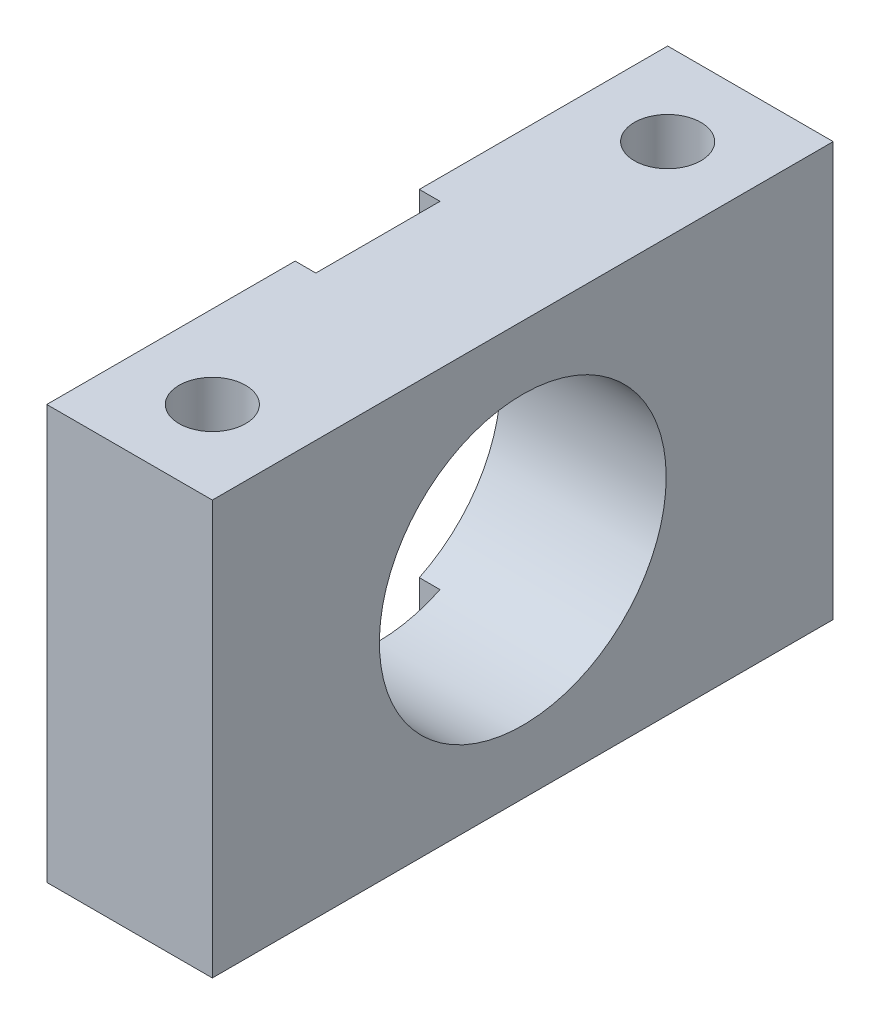
ISO-10303-21;
HEADER;
FILE_DESCRIPTION(('STEP AP214'),'2;1');
FILE_NAME('part.step','',(''),(''),'','','');
FILE_SCHEMA(('AUTOMOTIVE_DESIGN { 1 0 10303 214 1 1 1 1 }'));
ENDSEC;
DATA;
#1=APPLICATION_CONTEXT('core data for automotive mechanical design processes');
#2=APPLICATION_PROTOCOL_DEFINITION('international standard','automotive_design',2000,#1);
#3=PRODUCT_CONTEXT('',#1,'mechanical');
#4=PRODUCT('Part','Part','',(#3));
#5=PRODUCT_RELATED_PRODUCT_CATEGORY('part','',(#4));
#6=PRODUCT_DEFINITION_FORMATION('','',#4);
#7=PRODUCT_DEFINITION_CONTEXT('part definition',#1,'design');
#8=PRODUCT_DEFINITION('design','',#6,#7);
#9=PRODUCT_DEFINITION_SHAPE('','',#8);
#10=(LENGTH_UNIT() NAMED_UNIT(*) SI_UNIT(.MILLI.,.METRE.));
#11=(NAMED_UNIT(*) PLANE_ANGLE_UNIT() SI_UNIT($,.RADIAN.));
#12=(NAMED_UNIT(*) SI_UNIT($,.STERADIAN.) SOLID_ANGLE_UNIT());
#13=UNCERTAINTY_MEASURE_WITH_UNIT(LENGTH_MEASURE(1.E-05),#10,'distance_accuracy_value','');
#14=(GEOMETRIC_REPRESENTATION_CONTEXT(3) GLOBAL_UNCERTAINTY_ASSIGNED_CONTEXT((#13)) GLOBAL_UNIT_ASSIGNED_CONTEXT((#10,
#11,#12)) REPRESENTATION_CONTEXT('',''));
#15=CARTESIAN_POINT('',(0.,0.,0.));
#16=DIRECTION('',(0.,0.,1.));
#17=DIRECTION('',(1.,0.,0.));
#18=AXIS2_PLACEMENT_3D('',#15,#16,#17);
#19=CARTESIAN_POINT('',(-6.35,0.,0.));
#20=DIRECTION('',(1.,0.,0.));
#21=DIRECTION('',(0.,0.,-1.));
#22=AXIS2_PLACEMENT_3D('',#19,#20,#21);
#23=PLANE('',#22);
#24=DIRECTION('',(0.,0.,-1.));
#25=VECTOR('',#24,1.);
#26=CARTESIAN_POINT('',(-6.35,-15.875,-23.8125));
#27=LINE('',#26,#25);
#28=CARTESIAN_POINT('',(-6.35,-15.875,-4.7625));
#29=VERTEX_POINT('',#28);
#30=CARTESIAN_POINT('',(-6.35,-15.875,-23.8125));
#31=VERTEX_POINT('',#30);
#32=EDGE_CURVE('E230',#29,#31,#27,.T.);
#33=ORIENTED_EDGE('',*,*,#32,.F.);
#34=DIRECTION('',(0.,-1.,0.));
#35=VECTOR('',#34,1.);
#36=CARTESIAN_POINT('',(-6.35,-17.8246376290881,-4.7625));
#37=LINE('',#36,#35);
#38=CARTESIAN_POINT('',(-6.35,-9.91557329406626,-4.7625));
#39=VERTEX_POINT('',#38);
#40=EDGE_CURVE('E141',#39,#29,#37,.T.);
#41=ORIENTED_EDGE('',*,*,#40,.F.);
#42=CARTESIAN_POINT('',(-6.35,0.,0.));
#43=DIRECTION('',(1.,0.,0.));
#44=DIRECTION('',(0.,0.,-1.));
#45=AXIS2_PLACEMENT_3D('',#42,#43,#44);
#46=CIRCLE('',#45,11.);
#47=CARTESIAN_POINT('',(-6.35,9.91557329406626,-4.7625));
#48=VERTEX_POINT('',#47);
#49=EDGE_CURVE('E139',#39,#48,#46,.T.);
#50=ORIENTED_EDGE('',*,*,#49,.T.);
#51=CARTESIAN_POINT('',(-6.35,15.875,-4.7625));
#52=VERTEX_POINT('',#51);
#53=EDGE_CURVE('E123',#52,#48,#37,.T.);
#54=ORIENTED_EDGE('',*,*,#53,.F.);
#55=DIRECTION('',(0.,0.,1.));
#56=VECTOR('',#55,1.);
#57=CARTESIAN_POINT('',(-6.35,15.875,-23.8125));
#58=LINE('',#57,#56);
#59=CARTESIAN_POINT('',(-6.35,15.875,-23.8125));
#60=VERTEX_POINT('',#59);
#61=EDGE_CURVE('E136',#60,#52,#58,.T.);
#62=ORIENTED_EDGE('',*,*,#61,.F.);
#63=DIRECTION('',(0.,1.,0.));
#64=VECTOR('',#63,1.);
#65=CARTESIAN_POINT('',(-6.35,-15.875,-23.8125));
#66=LINE('',#65,#64);
#67=EDGE_CURVE('E155',#31,#60,#66,.T.);
#68=ORIENTED_EDGE('',*,*,#67,.F.);
#69=EDGE_LOOP('',(#33,#41,#50,#54,#62,#68));
#70=FACE_BOUND('',#69,.T.);
#71=ADVANCED_FACE('F33',(#70),#23,.F.);
#72=CARTESIAN_POINT('',(6.35,0.,0.));
#73=DIRECTION('',(1.,0.,0.));
#74=DIRECTION('',(0.,0.,-1.));
#75=AXIS2_PLACEMENT_3D('',#72,#73,#74);
#76=PLANE('',#75);
#77=DIRECTION('',(0.,-1.,0.));
#78=VECTOR('',#77,1.);
#79=CARTESIAN_POINT('',(6.35,-15.875,23.8125));
#80=LINE('',#79,#78);
#81=CARTESIAN_POINT('',(6.35,15.875,23.8125));
#82=VERTEX_POINT('',#81);
#83=CARTESIAN_POINT('',(6.35,-15.875,23.8125));
#84=VERTEX_POINT('',#83);
#85=EDGE_CURVE('E149',#82,#84,#80,.T.);
#86=ORIENTED_EDGE('',*,*,#85,.T.);
#87=DIRECTION('',(0.,0.,-1.));
#88=VECTOR('',#87,1.);
#89=CARTESIAN_POINT('',(6.35,-15.875,-23.8125));
#90=LINE('',#89,#88);
#91=CARTESIAN_POINT('',(6.35,-15.875,-23.8125));
#92=VERTEX_POINT('',#91);
#93=EDGE_CURVE('E153',#84,#92,#90,.T.);
#94=ORIENTED_EDGE('',*,*,#93,.T.);
#95=DIRECTION('',(0.,1.,0.));
#96=VECTOR('',#95,1.);
#97=CARTESIAN_POINT('',(6.35,-15.875,-23.8125));
#98=LINE('',#97,#96);
#99=CARTESIAN_POINT('',(6.35,15.875,-23.8125));
#100=VERTEX_POINT('',#99);
#101=EDGE_CURVE('E226',#92,#100,#98,.T.);
#102=ORIENTED_EDGE('',*,*,#101,.T.);
#103=DIRECTION('',(0.,0.,1.));
#104=VECTOR('',#103,1.);
#105=CARTESIAN_POINT('',(6.35,15.875,-23.8125));
#106=LINE('',#105,#104);
#107=EDGE_CURVE('E162',#100,#82,#106,.T.);
#108=ORIENTED_EDGE('',*,*,#107,.T.);
#109=EDGE_LOOP('',(#86,#94,#102,#108));
#110=FACE_BOUND('',#109,.T.);
#111=CARTESIAN_POINT('',(6.35,0.,0.));
#112=DIRECTION('',(1.,0.,0.));
#113=DIRECTION('',(0.,0.,-1.));
#114=AXIS2_PLACEMENT_3D('',#111,#112,#113);
#115=CIRCLE('',#114,11.);
#116=CARTESIAN_POINT('',(6.35,0.,-11.));
#117=VERTEX_POINT('',#116);
#118=EDGE_CURVE('E219',#117,#117,#115,.T.);
#119=ORIENTED_EDGE('',*,*,#118,.F.);
#120=EDGE_LOOP('',(#119));
#121=FACE_BOUND('',#120,.T.);
#122=ADVANCED_FACE('F241',(#110,#121),#76,.T.);
#123=CARTESIAN_POINT('',(-6.35,15.875,4.7625));
#124=VERTEX_POINT('',#123);
#125=CARTESIAN_POINT('',(-6.35,15.875,23.8125));
#126=VERTEX_POINT('',#125);
#127=EDGE_CURVE('E150',#124,#126,#58,.T.);
#128=ORIENTED_EDGE('',*,*,#127,.F.);
#129=DIRECTION('',(0.,1.,0.));
#130=VECTOR('',#129,1.);
#131=CARTESIAN_POINT('',(-6.35,-17.8246376290881,4.7625));
#132=LINE('',#131,#130);
#133=CARTESIAN_POINT('',(-6.35,9.91557329406626,4.7625));
#134=VERTEX_POINT('',#133);
#135=EDGE_CURVE('E140',#134,#124,#132,.T.);
#136=ORIENTED_EDGE('',*,*,#135,.F.);
#137=CARTESIAN_POINT('',(-6.35,-9.91557329406626,4.7625));
#138=VERTEX_POINT('',#137);
#139=EDGE_CURVE('E223',#134,#138,#46,.T.);
#140=ORIENTED_EDGE('',*,*,#139,.T.);
#141=CARTESIAN_POINT('',(-6.35,-15.875,4.7625));
#142=VERTEX_POINT('',#141);
#143=EDGE_CURVE('E198',#142,#138,#132,.T.);
#144=ORIENTED_EDGE('',*,*,#143,.F.);
#145=CARTESIAN_POINT('',(-6.35,-15.875,23.8125));
#146=VERTEX_POINT('',#145);
#147=EDGE_CURVE('E231',#146,#142,#27,.T.);
#148=ORIENTED_EDGE('',*,*,#147,.F.);
#149=DIRECTION('',(0.,-1.,0.));
#150=VECTOR('',#149,1.);
#151=CARTESIAN_POINT('',(-6.35,-15.875,23.8125));
#152=LINE('',#151,#150);
#153=EDGE_CURVE('E222',#126,#146,#152,.T.);
#154=ORIENTED_EDGE('',*,*,#153,.F.);
#155=EDGE_LOOP('',(#128,#136,#140,#144,#148,#154));
#156=FACE_BOUND('',#155,.T.);
#157=ADVANCED_FACE('F250',(#156),#23,.F.);
#158=CARTESIAN_POINT('',(6.35,-15.875,23.8125));
#159=DIRECTION('',(0.,0.,-1.));
#160=DIRECTION('',(-1.,0.,0.));
#161=AXIS2_PLACEMENT_3D('',#158,#159,#160);
#162=PLANE('',#161);
#163=ORIENTED_EDGE('',*,*,#153,.T.);
#164=DIRECTION('',(-1.,0.,0.));
#165=VECTOR('',#164,1.);
#166=CARTESIAN_POINT('',(6.35,-15.875,23.8125));
#167=LINE('',#166,#165);
#168=EDGE_CURVE('E167',#84,#146,#167,.T.);
#169=ORIENTED_EDGE('',*,*,#168,.F.);
#170=ORIENTED_EDGE('',*,*,#85,.F.);
#171=DIRECTION('',(-1.,0.,0.));
#172=VECTOR('',#171,1.);
#173=CARTESIAN_POINT('',(6.35,15.875,23.8125));
#174=LINE('',#173,#172);
#175=EDGE_CURVE('E159',#82,#126,#174,.T.);
#176=ORIENTED_EDGE('',*,*,#175,.T.);
#177=EDGE_LOOP('',(#163,#169,#170,#176));
#178=FACE_BOUND('',#177,.T.);
#179=ADVANCED_FACE('F35',(#178),#162,.F.);
#180=CARTESIAN_POINT('',(6.35,-15.875,-23.8125));
#181=DIRECTION('',(0.,1.,0.));
#182=DIRECTION('',(0.,0.,1.));
#183=AXIS2_PLACEMENT_3D('',#180,#181,#182);
#184=PLANE('',#183);
#185=CARTESIAN_POINT('',(0.,-15.875,-17.4625));
#186=DIRECTION('',(0.,1.,0.));
#187=DIRECTION('',(0.,0.,1.));
#188=AXIS2_PLACEMENT_3D('',#185,#186,#187);
#189=CIRCLE('',#188,2.5527);
#190=CARTESIAN_POINT('',(0.,-15.875,-14.9098));
#191=VERTEX_POINT('',#190);
#192=EDGE_CURVE('E207',#191,#191,#189,.T.);
#193=ORIENTED_EDGE('',*,*,#192,.T.);
#194=EDGE_LOOP('',(#193));
#195=FACE_BOUND('',#194,.T.);
#196=CARTESIAN_POINT('',(0.,-15.875,17.4625));
#197=DIRECTION('',(0.,-1.,0.));
#198=DIRECTION('',(0.,0.,-1.));
#199=AXIS2_PLACEMENT_3D('',#196,#197,#198);
#200=CIRCLE('',#199,2.5527);
#201=CARTESIAN_POINT('',(0.,-15.875,14.9098));
#202=VERTEX_POINT('',#201);
#203=EDGE_CURVE('E211',#202,#202,#200,.T.);
#204=ORIENTED_EDGE('',*,*,#203,.F.);
#205=EDGE_LOOP('',(#204));
#206=FACE_BOUND('',#205,.T.);
#207=DIRECTION('',(0.,0.,1.));
#208=VECTOR('',#207,1.);
#209=CARTESIAN_POINT('',(-4.7625,-15.875,-23.8125));
#210=LINE('',#209,#208);
#211=CARTESIAN_POINT('',(-4.7625,-15.875,-4.7625));
#212=VERTEX_POINT('',#211);
#213=CARTESIAN_POINT('',(-4.7625,-15.875,4.7625));
#214=VERTEX_POINT('',#213);
#215=EDGE_CURVE('E200',#212,#214,#210,.T.);
#216=ORIENTED_EDGE('',*,*,#215,.F.);
#217=DIRECTION('',(-1.,0.,0.));
#218=VECTOR('',#217,1.);
#219=CARTESIAN_POINT('',(6.35,-15.875,-4.7625));
#220=LINE('',#219,#218);
#221=EDGE_CURVE('E128',#212,#29,#220,.T.);
#222=ORIENTED_EDGE('',*,*,#221,.T.);
#223=ORIENTED_EDGE('',*,*,#32,.T.);
#224=DIRECTION('',(-1.,0.,0.));
#225=VECTOR('',#224,1.);
#226=CARTESIAN_POINT('',(6.35,-15.875,-23.8125));
#227=LINE('',#226,#225);
#228=EDGE_CURVE('E164',#92,#31,#227,.T.);
#229=ORIENTED_EDGE('',*,*,#228,.F.);
#230=ORIENTED_EDGE('',*,*,#93,.F.);
#231=ORIENTED_EDGE('',*,*,#168,.T.);
#232=ORIENTED_EDGE('',*,*,#147,.T.);
#233=DIRECTION('',(1.,0.,0.));
#234=VECTOR('',#233,1.);
#235=CARTESIAN_POINT('',(6.35,-15.875,4.7625));
#236=LINE('',#235,#234);
#237=EDGE_CURVE('E129',#142,#214,#236,.T.);
#238=ORIENTED_EDGE('',*,*,#237,.T.);
#239=EDGE_LOOP('',(#216,#222,#223,#229,#230,#231,#232,#238));
#240=FACE_BOUND('',#239,.T.);
#241=ADVANCED_FACE('F236',(#195,#206,#240),#184,.F.);
#242=CARTESIAN_POINT('',(6.35,-15.875,-23.8125));
#243=DIRECTION('',(0.,0.,1.));
#244=DIRECTION('',(0.,-1.,0.));
#245=AXIS2_PLACEMENT_3D('',#242,#243,#244);
#246=PLANE('',#245);
#247=ORIENTED_EDGE('',*,*,#67,.T.);
#248=DIRECTION('',(-1.,0.,0.));
#249=VECTOR('',#248,1.);
#250=CARTESIAN_POINT('',(6.35,15.875,-23.8125));
#251=LINE('',#250,#249);
#252=EDGE_CURVE('E148',#100,#60,#251,.T.);
#253=ORIENTED_EDGE('',*,*,#252,.F.);
#254=ORIENTED_EDGE('',*,*,#101,.F.);
#255=ORIENTED_EDGE('',*,*,#228,.T.);
#256=EDGE_LOOP('',(#247,#253,#254,#255));
#257=FACE_BOUND('',#256,.T.);
#258=ADVANCED_FACE('F239',(#257),#246,.F.);
#259=CARTESIAN_POINT('',(6.35,15.875,-23.8125));
#260=DIRECTION('',(0.,-1.,0.));
#261=DIRECTION('',(0.,0.,-1.));
#262=AXIS2_PLACEMENT_3D('',#259,#260,#261);
#263=PLANE('',#262);
#264=ORIENTED_EDGE('',*,*,#61,.T.);
#265=DIRECTION('',(1.,0.,0.));
#266=VECTOR('',#265,1.);
#267=CARTESIAN_POINT('',(6.35,15.875,-4.7625));
#268=LINE('',#267,#266);
#269=CARTESIAN_POINT('',(-4.7625,15.875,-4.7625));
#270=VERTEX_POINT('',#269);
#271=EDGE_CURVE('E120',#52,#270,#268,.T.);
#272=ORIENTED_EDGE('',*,*,#271,.T.);
#273=DIRECTION('',(0.,0.,-1.));
#274=VECTOR('',#273,1.);
#275=CARTESIAN_POINT('',(-4.7625,15.875,-23.8125));
#276=LINE('',#275,#274);
#277=CARTESIAN_POINT('',(-4.7625,15.875,4.7625));
#278=VERTEX_POINT('',#277);
#279=EDGE_CURVE('E193',#278,#270,#276,.T.);
#280=ORIENTED_EDGE('',*,*,#279,.F.);
#281=DIRECTION('',(-1.,0.,0.));
#282=VECTOR('',#281,1.);
#283=CARTESIAN_POINT('',(6.35,15.875,4.7625));
#284=LINE('',#283,#282);
#285=EDGE_CURVE('E191',#278,#124,#284,.T.);
#286=ORIENTED_EDGE('',*,*,#285,.T.);
#287=ORIENTED_EDGE('',*,*,#127,.T.);
#288=ORIENTED_EDGE('',*,*,#175,.F.);
#289=ORIENTED_EDGE('',*,*,#107,.F.);
#290=ORIENTED_EDGE('',*,*,#252,.T.);
#291=EDGE_LOOP('',(#264,#272,#280,#286,#287,#288,#289,#290));
#292=FACE_BOUND('',#291,.T.);
#293=CARTESIAN_POINT('',(0.,15.875,-17.4625));
#294=DIRECTION('',(0.,1.,0.));
#295=DIRECTION('',(0.,0.,1.));
#296=AXIS2_PLACEMENT_3D('',#293,#294,#295);
#297=CIRCLE('',#296,2.5527);
#298=CARTESIAN_POINT('',(0.,15.875,-14.9098));
#299=VERTEX_POINT('',#298);
#300=EDGE_CURVE('E208',#299,#299,#297,.T.);
#301=ORIENTED_EDGE('',*,*,#300,.F.);
#302=EDGE_LOOP('',(#301));
#303=FACE_BOUND('',#302,.T.);
#304=CARTESIAN_POINT('',(0.,15.875,17.4625));
#305=DIRECTION('',(0.,-1.,0.));
#306=DIRECTION('',(0.,0.,-1.));
#307=AXIS2_PLACEMENT_3D('',#304,#305,#306);
#308=CIRCLE('',#307,2.5527);
#309=CARTESIAN_POINT('',(0.,15.875,14.9098));
#310=VERTEX_POINT('',#309);
#311=EDGE_CURVE('E214',#310,#310,#308,.T.);
#312=ORIENTED_EDGE('',*,*,#311,.T.);
#313=EDGE_LOOP('',(#312));
#314=FACE_BOUND('',#313,.T.);
#315=ADVANCED_FACE('F144',(#292,#303,#314),#263,.F.);
#316=CARTESIAN_POINT('',(6.35,0.,0.));
#317=DIRECTION('',(-1.,0.,0.));
#318=DIRECTION('',(0.,0.,1.));
#319=AXIS2_PLACEMENT_3D('',#316,#317,#318);
#320=CYLINDRICAL_SURFACE('',#319,11.);
#321=DIRECTION('',(-1.,0.,0.));
#322=VECTOR('',#321,1.);
#323=CARTESIAN_POINT('',(6.35,9.91557329406626,-4.7625));
#324=LINE('',#323,#322);
#325=CARTESIAN_POINT('',(-4.7625,9.91557329406626,-4.7625));
#326=VERTEX_POINT('',#325);
#327=EDGE_CURVE('E11',#48,#326,#324,.F.);
#328=ORIENTED_EDGE('',*,*,#327,.F.);
#329=ORIENTED_EDGE('',*,*,#49,.F.);
#330=DIRECTION('',(-1.,0.,0.));
#331=VECTOR('',#330,1.);
#332=CARTESIAN_POINT('',(6.35,-9.91557329406626,-4.7625));
#333=LINE('',#332,#331);
#334=CARTESIAN_POINT('',(-4.7625,-9.91557329406626,-4.7625));
#335=VERTEX_POINT('',#334);
#336=EDGE_CURVE('E176',#335,#39,#333,.T.);
#337=ORIENTED_EDGE('',*,*,#336,.F.);
#338=CARTESIAN_POINT('',(-4.7625,0.,0.));
#339=DIRECTION('',(-1.,0.,0.));
#340=DIRECTION('',(0.,0.,1.));
#341=AXIS2_PLACEMENT_3D('',#338,#339,#340);
#342=CIRCLE('',#341,11.);
#343=CARTESIAN_POINT('',(-4.7625,-9.91557329406626,4.7625));
#344=VERTEX_POINT('',#343);
#345=EDGE_CURVE('E170',#335,#344,#342,.T.);
#346=ORIENTED_EDGE('',*,*,#345,.T.);
#347=DIRECTION('',(-1.,0.,0.));
#348=VECTOR('',#347,1.);
#349=CARTESIAN_POINT('',(6.35,-9.91557329406626,4.7625));
#350=LINE('',#349,#348);
#351=EDGE_CURVE('E173',#138,#344,#350,.F.);
#352=ORIENTED_EDGE('',*,*,#351,.F.);
#353=ORIENTED_EDGE('',*,*,#139,.F.);
#354=DIRECTION('',(-1.,0.,0.));
#355=VECTOR('',#354,1.);
#356=CARTESIAN_POINT('',(6.35,9.91557329406626,4.7625));
#357=LINE('',#356,#355);
#358=CARTESIAN_POINT('',(-4.7625,9.91557329406626,4.7625));
#359=VERTEX_POINT('',#358);
#360=EDGE_CURVE('E41',#359,#134,#357,.T.);
#361=ORIENTED_EDGE('',*,*,#360,.F.);
#362=EDGE_CURVE('E174',#359,#326,#342,.T.);
#363=ORIENTED_EDGE('',*,*,#362,.T.);
#364=EDGE_LOOP('',(#328,#329,#337,#346,#352,#353,#361,#363));
#365=FACE_BOUND('',#364,.T.);
#366=ORIENTED_EDGE('',*,*,#118,.T.);
#367=EDGE_LOOP('',(#366));
#368=FACE_BOUND('',#367,.T.);
#369=ADVANCED_FACE('F183',(#365,#368),#320,.F.);
#370=CARTESIAN_POINT('',(0.,15.875,17.4625));
#371=DIRECTION('',(0.,-1.,0.));
#372=DIRECTION('',(0.,0.,-1.));
#373=AXIS2_PLACEMENT_3D('',#370,#371,#372);
#374=CYLINDRICAL_SURFACE('',#373,2.5527);
#375=ORIENTED_EDGE('',*,*,#311,.F.);
#376=EDGE_LOOP('',(#375));
#377=FACE_BOUND('',#376,.T.);
#378=ORIENTED_EDGE('',*,*,#203,.T.);
#379=EDGE_LOOP('',(#378));
#380=FACE_BOUND('',#379,.T.);
#381=ADVANCED_FACE('F294',(#377,#380),#374,.F.);
#382=CARTESIAN_POINT('',(0.,15.875,-17.4625));
#383=DIRECTION('',(0.,-1.,0.));
#384=DIRECTION('',(0.,0.,-1.));
#385=AXIS2_PLACEMENT_3D('',#382,#383,#384);
#386=CYLINDRICAL_SURFACE('',#385,2.5527);
#387=ORIENTED_EDGE('',*,*,#300,.T.);
#388=EDGE_LOOP('',(#387));
#389=FACE_BOUND('',#388,.T.);
#390=ORIENTED_EDGE('',*,*,#192,.F.);
#391=EDGE_LOOP('',(#390));
#392=FACE_BOUND('',#391,.T.);
#393=ADVANCED_FACE('F299',(#389,#392),#386,.F.);
#394=CARTESIAN_POINT('',(-4.7625,0.,0.));
#395=DIRECTION('',(-1.,0.,0.));
#396=DIRECTION('',(0.,0.,1.));
#397=AXIS2_PLACEMENT_3D('',#394,#395,#396);
#398=PLANE('',#397);
#399=ORIENTED_EDGE('',*,*,#215,.T.);
#400=DIRECTION('',(0.,1.,0.));
#401=VECTOR('',#400,1.);
#402=CARTESIAN_POINT('',(-4.7625,-17.8246376290881,4.7625));
#403=LINE('',#402,#401);
#404=EDGE_CURVE('E55',#214,#344,#403,.T.);
#405=ORIENTED_EDGE('',*,*,#404,.T.);
#406=ORIENTED_EDGE('',*,*,#345,.F.);
#407=DIRECTION('',(0.,-1.,0.));
#408=VECTOR('',#407,1.);
#409=CARTESIAN_POINT('',(-4.7625,-17.8246376290881,-4.7625));
#410=LINE('',#409,#408);
#411=EDGE_CURVE('E194',#335,#212,#410,.T.);
#412=ORIENTED_EDGE('',*,*,#411,.T.);
#413=EDGE_LOOP('',(#399,#405,#406,#412));
#414=FACE_BOUND('',#413,.T.);
#415=ADVANCED_FACE('F257',(#414),#398,.T.);
#416=CARTESIAN_POINT('',(-4.7625,-17.8246376290881,4.7625));
#417=DIRECTION('',(0.,0.,1.));
#418=DIRECTION('',(1.,0.,0.));
#419=AXIS2_PLACEMENT_3D('',#416,#417,#418);
#420=PLANE('',#419);
#421=ORIENTED_EDGE('',*,*,#143,.T.);
#422=ORIENTED_EDGE('',*,*,#351,.T.);
#423=ORIENTED_EDGE('',*,*,#404,.F.);
#424=ORIENTED_EDGE('',*,*,#237,.F.);
#425=EDGE_LOOP('',(#421,#422,#423,#424));
#426=FACE_BOUND('',#425,.T.);
#427=ADVANCED_FACE('F260',(#426),#420,.F.);
#428=CARTESIAN_POINT('',(-4.7625,-17.8246376290881,-4.7625));
#429=DIRECTION('',(0.,0.,-1.));
#430=DIRECTION('',(0.,1.,0.));
#431=AXIS2_PLACEMENT_3D('',#428,#429,#430);
#432=PLANE('',#431);
#433=ORIENTED_EDGE('',*,*,#411,.F.);
#434=ORIENTED_EDGE('',*,*,#336,.T.);
#435=ORIENTED_EDGE('',*,*,#40,.T.);
#436=ORIENTED_EDGE('',*,*,#221,.F.);
#437=EDGE_LOOP('',(#433,#434,#435,#436));
#438=FACE_BOUND('',#437,.T.);
#439=ADVANCED_FACE('F261',(#438),#432,.F.);
#440=ORIENTED_EDGE('',*,*,#53,.T.);
#441=ORIENTED_EDGE('',*,*,#327,.T.);
#442=EDGE_CURVE('E48',#270,#326,#410,.T.);
#443=ORIENTED_EDGE('',*,*,#442,.F.);
#444=ORIENTED_EDGE('',*,*,#271,.F.);
#445=EDGE_LOOP('',(#440,#441,#443,#444));
#446=FACE_BOUND('',#445,.T.);
#447=ADVANCED_FACE('F122',(#446),#432,.F.);
#448=EDGE_CURVE('E188',#359,#278,#403,.T.);
#449=ORIENTED_EDGE('',*,*,#448,.F.);
#450=ORIENTED_EDGE('',*,*,#360,.T.);
#451=ORIENTED_EDGE('',*,*,#135,.T.);
#452=ORIENTED_EDGE('',*,*,#285,.F.);
#453=EDGE_LOOP('',(#449,#450,#451,#452));
#454=FACE_BOUND('',#453,.T.);
#455=ADVANCED_FACE('F189',(#454),#420,.F.);
#456=ORIENTED_EDGE('',*,*,#279,.T.);
#457=ORIENTED_EDGE('',*,*,#442,.T.);
#458=ORIENTED_EDGE('',*,*,#362,.F.);
#459=ORIENTED_EDGE('',*,*,#448,.T.);
#460=EDGE_LOOP('',(#456,#457,#458,#459));
#461=FACE_BOUND('',#460,.T.);
#462=ADVANCED_FACE('F187',(#461),#398,.T.);
#463=CLOSED_SHELL('',(#71,#122,#157,#179,#241,#258,#315,#369,#381,#393,#415,#427,#439,#447,#455,#462));
#464=MANIFOLD_SOLID_BREP('B2',#463);
#465=ADVANCED_BREP_SHAPE_REPRESENTATION('',(#18,#464),#14);
#466=SHAPE_DEFINITION_REPRESENTATION(#9,#465);
ENDSEC;
END-ISO-10303-21;
